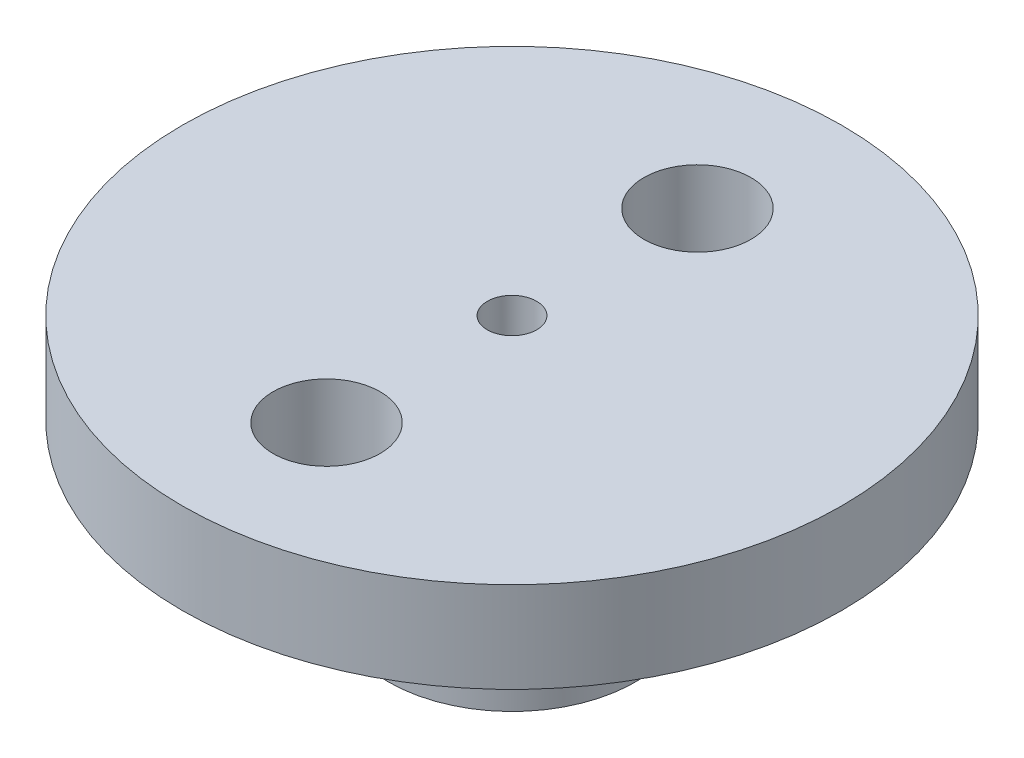
ISO-10303-21;
HEADER;
FILE_DESCRIPTION(('STEP AP214'),'2;1');
FILE_NAME('part.step','',(''),(''),'','','');
FILE_SCHEMA(('AUTOMOTIVE_DESIGN { 1 0 10303 214 1 1 1 1 }'));
ENDSEC;
DATA;
#1=APPLICATION_CONTEXT('core data for automotive mechanical design processes');
#2=APPLICATION_PROTOCOL_DEFINITION('international standard','automotive_design',2000,#1);
#3=PRODUCT_CONTEXT('',#1,'mechanical');
#4=PRODUCT('Part','Part','',(#3));
#5=PRODUCT_RELATED_PRODUCT_CATEGORY('part','',(#4));
#6=PRODUCT_DEFINITION_FORMATION('','',#4);
#7=PRODUCT_DEFINITION_CONTEXT('part definition',#1,'design');
#8=PRODUCT_DEFINITION('design','',#6,#7);
#9=PRODUCT_DEFINITION_SHAPE('','',#8);
#10=(LENGTH_UNIT() NAMED_UNIT(*) SI_UNIT(.MILLI.,.METRE.));
#11=(NAMED_UNIT(*) PLANE_ANGLE_UNIT() SI_UNIT($,.RADIAN.));
#12=(NAMED_UNIT(*) SI_UNIT($,.STERADIAN.) SOLID_ANGLE_UNIT());
#13=UNCERTAINTY_MEASURE_WITH_UNIT(LENGTH_MEASURE(1.E-05),#10,'distance_accuracy_value','');
#14=(GEOMETRIC_REPRESENTATION_CONTEXT(3) GLOBAL_UNCERTAINTY_ASSIGNED_CONTEXT((#13)) GLOBAL_UNIT_ASSIGNED_CONTEXT((#10,
#11,#12)) REPRESENTATION_CONTEXT('',''));
#15=CARTESIAN_POINT('',(0.,0.,0.));
#16=DIRECTION('',(0.,0.,1.));
#17=DIRECTION('',(1.,0.,0.));
#18=AXIS2_PLACEMENT_3D('',#15,#16,#17);
#19=CARTESIAN_POINT('',(0.,2.2,0.));
#20=DIRECTION('',(0.,-1.,0.));
#21=DIRECTION('',(0.,0.,-1.));
#22=AXIS2_PLACEMENT_3D('',#19,#20,#21);
#23=CYLINDRICAL_SURFACE('',#22,8.);
#24=CARTESIAN_POINT('',(0.,2.2,0.));
#25=DIRECTION('',(0.,1.,0.));
#26=DIRECTION('',(0.,0.,1.));
#27=AXIS2_PLACEMENT_3D('',#24,#25,#26);
#28=CIRCLE('',#27,8.);
#29=CARTESIAN_POINT('',(0.,2.2,8.));
#30=VERTEX_POINT('',#29);
#31=EDGE_CURVE('E45',#30,#30,#28,.T.);
#32=ORIENTED_EDGE('',*,*,#31,.F.);
#33=EDGE_LOOP('',(#32));
#34=FACE_BOUND('',#33,.T.);
#35=CARTESIAN_POINT('',(0.,0.,0.));
#36=DIRECTION('',(0.,1.,0.));
#37=DIRECTION('',(0.,0.,1.));
#38=AXIS2_PLACEMENT_3D('',#35,#36,#37);
#39=CIRCLE('',#38,8.);
#40=CARTESIAN_POINT('',(0.,0.,8.));
#41=VERTEX_POINT('',#40);
#42=EDGE_CURVE('E49',#41,#41,#39,.T.);
#43=ORIENTED_EDGE('',*,*,#42,.T.);
#44=EDGE_LOOP('',(#43));
#45=FACE_BOUND('',#44,.T.);
#46=ADVANCED_FACE('F39',(#34,#45),#23,.T.);
#47=CARTESIAN_POINT('',(0.,2.2,0.));
#48=DIRECTION('',(0.,1.,0.));
#49=DIRECTION('',(0.,0.,1.));
#50=AXIS2_PLACEMENT_3D('',#47,#48,#49);
#51=PLANE('',#50);
#52=CARTESIAN_POINT('',(0.,2.2,0.));
#53=DIRECTION('',(0.,1.,0.));
#54=DIRECTION('',(0.,0.,1.));
#55=AXIS2_PLACEMENT_3D('',#52,#53,#54);
#56=CIRCLE('',#55,0.6);
#57=CARTESIAN_POINT('',(0.,2.2,0.6));
#58=VERTEX_POINT('',#57);
#59=EDGE_CURVE('E74',#58,#58,#56,.F.);
#60=ORIENTED_EDGE('',*,*,#59,.T.);
#61=EDGE_LOOP('',(#60));
#62=FACE_BOUND('',#61,.T.);
#63=CARTESIAN_POINT('',(0.,2.2,4.50000000000001));
#64=DIRECTION('',(0.,1.,0.));
#65=DIRECTION('',(0.,0.,-1.));
#66=AXIS2_PLACEMENT_3D('',#63,#64,#65);
#67=CIRCLE('',#66,1.3);
#68=CARTESIAN_POINT('',(0.,2.2,3.20000000000001));
#69=VERTEX_POINT('',#68);
#70=EDGE_CURVE('E63',#69,#69,#67,.T.);
#71=ORIENTED_EDGE('',*,*,#70,.F.);
#72=EDGE_LOOP('',(#71));
#73=FACE_BOUND('',#72,.T.);
#74=CARTESIAN_POINT('',(0.,2.2,-4.5));
#75=DIRECTION('',(0.,1.,0.));
#76=DIRECTION('',(0.,0.,1.));
#77=AXIS2_PLACEMENT_3D('',#74,#75,#76);
#78=CIRCLE('',#77,1.3);
#79=CARTESIAN_POINT('',(0.,2.2,-3.2));
#80=VERTEX_POINT('',#79);
#81=EDGE_CURVE('E56',#80,#80,#78,.T.);
#82=ORIENTED_EDGE('',*,*,#81,.F.);
#83=EDGE_LOOP('',(#82));
#84=FACE_BOUND('',#83,.T.);
#85=ORIENTED_EDGE('',*,*,#31,.T.);
#86=EDGE_LOOP('',(#85));
#87=FACE_BOUND('',#86,.T.);
#88=ADVANCED_FACE('F106',(#62,#73,#84,#87),#51,.T.);
#89=CARTESIAN_POINT('',(0.,0.,0.));
#90=DIRECTION('',(0.,1.,0.));
#91=DIRECTION('',(0.,0.,1.));
#92=AXIS2_PLACEMENT_3D('',#89,#90,#91);
#93=PLANE('',#92);
#94=CARTESIAN_POINT('',(0.,0.,0.));
#95=DIRECTION('',(0.,1.,0.));
#96=DIRECTION('',(0.,0.,1.));
#97=AXIS2_PLACEMENT_3D('',#94,#95,#96);
#98=CIRCLE('',#97,3.);
#99=CARTESIAN_POINT('',(0.,0.,3.));
#100=VERTEX_POINT('',#99);
#101=EDGE_CURVE('E10',#100,#100,#98,.F.);
#102=ORIENTED_EDGE('',*,*,#101,.F.);
#103=EDGE_LOOP('',(#102));
#104=FACE_BOUND('',#103,.T.);
#105=CARTESIAN_POINT('',(0.,0.,4.50000000000001));
#106=DIRECTION('',(0.,1.,0.));
#107=DIRECTION('',(0.,0.,-1.));
#108=AXIS2_PLACEMENT_3D('',#105,#106,#107);
#109=CIRCLE('',#108,1.3);
#110=CARTESIAN_POINT('',(0.,0.,3.20000000000001));
#111=VERTEX_POINT('',#110);
#112=EDGE_CURVE('E54',#111,#111,#109,.T.);
#113=ORIENTED_EDGE('',*,*,#112,.T.);
#114=EDGE_LOOP('',(#113));
#115=FACE_BOUND('',#114,.T.);
#116=CARTESIAN_POINT('',(0.,0.,-4.5));
#117=DIRECTION('',(0.,1.,0.));
#118=DIRECTION('',(0.,0.,1.));
#119=AXIS2_PLACEMENT_3D('',#116,#117,#118);
#120=CIRCLE('',#119,1.3);
#121=CARTESIAN_POINT('',(0.,0.,-3.2));
#122=VERTEX_POINT('',#121);
#123=EDGE_CURVE('E59',#122,#122,#120,.T.);
#124=ORIENTED_EDGE('',*,*,#123,.T.);
#125=EDGE_LOOP('',(#124));
#126=FACE_BOUND('',#125,.T.);
#127=ORIENTED_EDGE('',*,*,#42,.F.);
#128=EDGE_LOOP('',(#127));
#129=FACE_BOUND('',#128,.T.);
#130=ADVANCED_FACE('F90',(#104,#115,#126,#129),#93,.F.);
#131=CARTESIAN_POINT('',(0.,0.,-4.5));
#132=DIRECTION('',(0.,1.,0.));
#133=DIRECTION('',(0.,0.,1.));
#134=AXIS2_PLACEMENT_3D('',#131,#132,#133);
#135=CYLINDRICAL_SURFACE('',#134,1.3);
#136=ORIENTED_EDGE('',*,*,#123,.F.);
#137=EDGE_LOOP('',(#136));
#138=FACE_BOUND('',#137,.T.);
#139=ORIENTED_EDGE('',*,*,#81,.T.);
#140=EDGE_LOOP('',(#139));
#141=FACE_BOUND('',#140,.T.);
#142=ADVANCED_FACE('F117',(#138,#141),#135,.F.);
#143=CARTESIAN_POINT('',(0.,0.,4.50000000000001));
#144=DIRECTION('',(0.,1.,0.));
#145=DIRECTION('',(0.,0.,1.));
#146=AXIS2_PLACEMENT_3D('',#143,#144,#145);
#147=CYLINDRICAL_SURFACE('',#146,1.3);
#148=ORIENTED_EDGE('',*,*,#112,.F.);
#149=EDGE_LOOP('',(#148));
#150=FACE_BOUND('',#149,.T.);
#151=ORIENTED_EDGE('',*,*,#70,.T.);
#152=EDGE_LOOP('',(#151));
#153=FACE_BOUND('',#152,.T.);
#154=ADVANCED_FACE('F122',(#150,#153),#147,.F.);
#155=CARTESIAN_POINT('',(0.,-4.,0.));
#156=DIRECTION('',(0.,-1.,0.));
#157=DIRECTION('',(0.,0.,-1.));
#158=AXIS2_PLACEMENT_3D('',#155,#156,#157);
#159=PLANE('',#158);
#160=CARTESIAN_POINT('',(0.,-4.,0.));
#161=DIRECTION('',(0.,-1.,0.));
#162=DIRECTION('',(0.,0.,-1.));
#163=AXIS2_PLACEMENT_3D('',#160,#161,#162);
#164=CIRCLE('',#163,3.);
#165=CARTESIAN_POINT('',(0.,-4.,-3.));
#166=VERTEX_POINT('',#165);
#167=EDGE_CURVE('E60',#166,#166,#164,.T.);
#168=ORIENTED_EDGE('',*,*,#167,.T.);
#169=EDGE_LOOP('',(#168));
#170=FACE_BOUND('',#169,.T.);
#171=CARTESIAN_POINT('',(0.,-4.,0.));
#172=DIRECTION('',(0.,-1.,0.));
#173=DIRECTION('',(0.,0.,-1.));
#174=AXIS2_PLACEMENT_3D('',#171,#172,#173);
#175=CIRCLE('',#174,2.45);
#176=CARTESIAN_POINT('',(0.,-4.,-2.45));
#177=VERTEX_POINT('',#176);
#178=EDGE_CURVE('E70',#177,#177,#175,.T.);
#179=ORIENTED_EDGE('',*,*,#178,.F.);
#180=EDGE_LOOP('',(#179));
#181=FACE_BOUND('',#180,.T.);
#182=ADVANCED_FACE('F100',(#170,#181),#159,.T.);
#183=CARTESIAN_POINT('',(0.,-4.,0.));
#184=DIRECTION('',(0.,1.,0.));
#185=DIRECTION('',(0.,0.,1.));
#186=AXIS2_PLACEMENT_3D('',#183,#184,#185);
#187=CYLINDRICAL_SURFACE('',#186,3.);
#188=ORIENTED_EDGE('',*,*,#167,.F.);
#189=EDGE_LOOP('',(#188));
#190=FACE_BOUND('',#189,.T.);
#191=ORIENTED_EDGE('',*,*,#101,.T.);
#192=EDGE_LOOP('',(#191));
#193=FACE_BOUND('',#192,.T.);
#194=ADVANCED_FACE('F94',(#190,#193),#187,.T.);
#195=CARTESIAN_POINT('',(0.,-4.,0.));
#196=DIRECTION('',(0.,1.,0.));
#197=DIRECTION('',(0.,0.,1.));
#198=AXIS2_PLACEMENT_3D('',#195,#196,#197);
#199=CYLINDRICAL_SURFACE('',#198,2.45);
#200=ORIENTED_EDGE('',*,*,#178,.T.);
#201=EDGE_LOOP('',(#200));
#202=FACE_BOUND('',#201,.T.);
#203=CARTESIAN_POINT('',(0.,0.,0.));
#204=DIRECTION('',(0.,-1.,0.));
#205=DIRECTION('',(0.,0.,-1.));
#206=AXIS2_PLACEMENT_3D('',#203,#204,#205);
#207=CIRCLE('',#206,2.45);
#208=CARTESIAN_POINT('',(0.,0.,-2.45));
#209=VERTEX_POINT('',#208);
#210=EDGE_CURVE('E71',#209,#209,#207,.T.);
#211=ORIENTED_EDGE('',*,*,#210,.F.);
#212=EDGE_LOOP('',(#211));
#213=FACE_BOUND('',#212,.T.);
#214=ADVANCED_FACE('F89',(#202,#213),#199,.F.);
#215=CARTESIAN_POINT('',(0.,0.,0.));
#216=DIRECTION('',(0.,-1.,0.));
#217=DIRECTION('',(0.,0.,-1.));
#218=AXIS2_PLACEMENT_3D('',#215,#216,#217);
#219=CIRCLE('',#218,0.6);
#220=CARTESIAN_POINT('',(0.,0.,-0.6));
#221=VERTEX_POINT('',#220);
#222=EDGE_CURVE('E79',#221,#221,#219,.T.);
#223=ORIENTED_EDGE('',*,*,#222,.F.);
#224=EDGE_LOOP('',(#223));
#225=FACE_BOUND('',#224,.T.);
#226=ORIENTED_EDGE('',*,*,#210,.T.);
#227=EDGE_LOOP('',(#226));
#228=FACE_BOUND('',#227,.T.);
#229=ADVANCED_FACE('F86',(#225,#228),#93,.F.);
#230=CARTESIAN_POINT('',(0.,3.89705627484771,0.));
#231=DIRECTION('',(0.,-1.,0.));
#232=DIRECTION('',(0.,0.,-1.));
#233=AXIS2_PLACEMENT_3D('',#230,#231,#232);
#234=CYLINDRICAL_SURFACE('',#233,0.6);
#235=ORIENTED_EDGE('',*,*,#222,.T.);
#236=EDGE_LOOP('',(#235));
#237=FACE_BOUND('',#236,.T.);
#238=ORIENTED_EDGE('',*,*,#59,.F.);
#239=EDGE_LOOP('',(#238));
#240=FACE_BOUND('',#239,.T.);
#241=ADVANCED_FACE('F83',(#237,#240),#234,.F.);
#242=CLOSED_SHELL('',(#46,#88,#130,#142,#154,#182,#194,#214,#229,#241));
#243=MANIFOLD_SOLID_BREP('B2',#242);
#244=ADVANCED_BREP_SHAPE_REPRESENTATION('',(#18,#243),#14);
#245=SHAPE_DEFINITION_REPRESENTATION(#9,#244);
ENDSEC;
END-ISO-10303-21;
